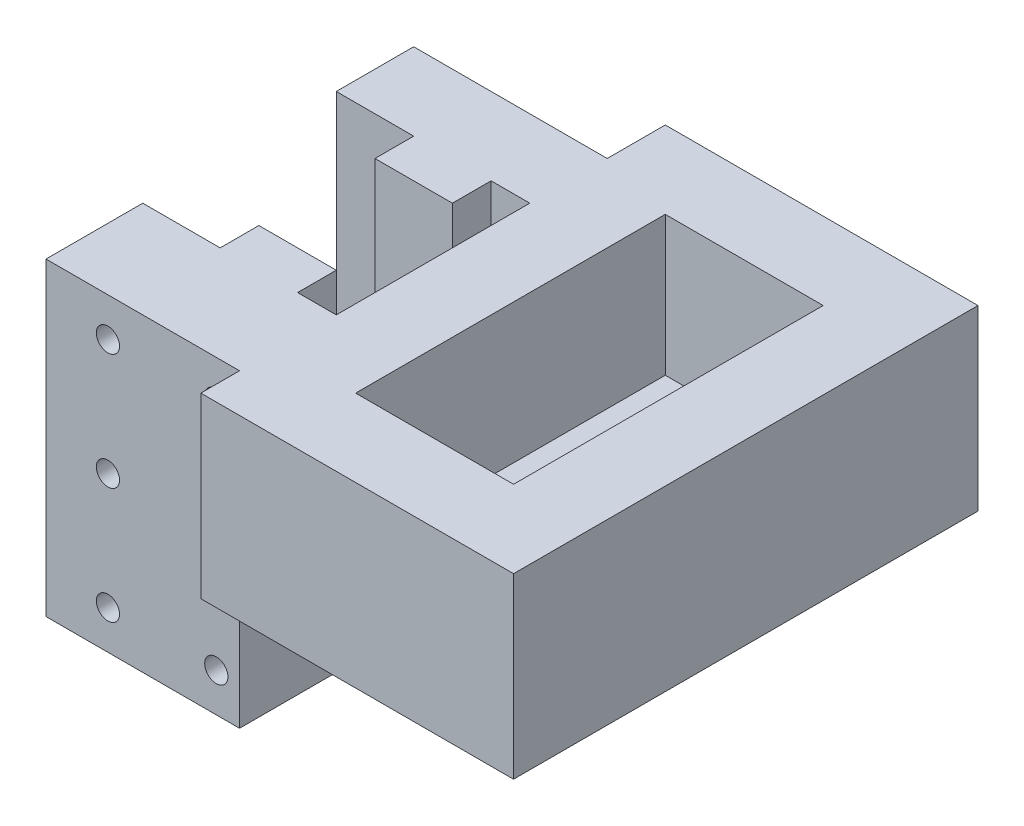
ISO-10303-21;
HEADER;
FILE_DESCRIPTION(('STEP AP214'),'2;1');
FILE_NAME('part.step','',(''),(''),'','','');
FILE_SCHEMA(('AUTOMOTIVE_DESIGN { 1 0 10303 214 1 1 1 1 }'));
ENDSEC;
DATA;
#1=APPLICATION_CONTEXT('core data for automotive mechanical design processes');
#2=APPLICATION_PROTOCOL_DEFINITION('international standard','automotive_design',2000,#1);
#3=PRODUCT_CONTEXT('',#1,'mechanical');
#4=PRODUCT('Part','Part','',(#3));
#5=PRODUCT_RELATED_PRODUCT_CATEGORY('part','',(#4));
#6=PRODUCT_DEFINITION_FORMATION('','',#4);
#7=PRODUCT_DEFINITION_CONTEXT('part definition',#1,'design');
#8=PRODUCT_DEFINITION('design','',#6,#7);
#9=PRODUCT_DEFINITION_SHAPE('','',#8);
#10=(LENGTH_UNIT() NAMED_UNIT(*) SI_UNIT(.MILLI.,.METRE.));
#11=(NAMED_UNIT(*) PLANE_ANGLE_UNIT() SI_UNIT($,.RADIAN.));
#12=(NAMED_UNIT(*) SI_UNIT($,.STERADIAN.) SOLID_ANGLE_UNIT());
#13=UNCERTAINTY_MEASURE_WITH_UNIT(LENGTH_MEASURE(1.E-05),#10,'distance_accuracy_value','');
#14=(GEOMETRIC_REPRESENTATION_CONTEXT(3) GLOBAL_UNCERTAINTY_ASSIGNED_CONTEXT((#13)) GLOBAL_UNIT_ASSIGNED_CONTEXT((#10,
#11,#12)) REPRESENTATION_CONTEXT('',''));
#15=CARTESIAN_POINT('',(0.,0.,0.));
#16=DIRECTION('',(0.,0.,1.));
#17=DIRECTION('',(1.,0.,0.));
#18=AXIS2_PLACEMENT_3D('',#15,#16,#17);
#19=CARTESIAN_POINT('',(-20.2,18.,30.));
#20=DIRECTION('',(1.,0.,0.));
#21=DIRECTION('',(0.,0.,-1.));
#22=AXIS2_PLACEMENT_3D('',#19,#20,#21);
#23=PLANE('',#22);
#24=DIRECTION('',(0.,1.,0.));
#25=VECTOR('',#24,1.);
#26=CARTESIAN_POINT('',(-20.2,-22.,-12.5));
#27=LINE('',#26,#25);
#28=CARTESIAN_POINT('',(-20.2,-5.,-12.5));
#29=VERTEX_POINT('',#28);
#30=CARTESIAN_POINT('',(-20.2,18.,-12.5));
#31=VERTEX_POINT('',#30);
#32=EDGE_CURVE('E303',#29,#31,#27,.T.);
#33=ORIENTED_EDGE('',*,*,#32,.F.);
#34=DIRECTION('',(0.,0.,-1.));
#35=VECTOR('',#34,1.);
#36=CARTESIAN_POINT('',(-20.2,-5.,-30.));
#37=LINE('',#36,#35);
#38=CARTESIAN_POINT('',(-20.2,-5.,12.5));
#39=VERTEX_POINT('',#38);
#40=EDGE_CURVE('E487',#39,#29,#37,.T.);
#41=ORIENTED_EDGE('',*,*,#40,.F.);
#42=DIRECTION('',(0.,1.,0.));
#43=VECTOR('',#42,1.);
#44=CARTESIAN_POINT('',(-20.2,-22.,12.5));
#45=LINE('',#44,#43);
#46=CARTESIAN_POINT('',(-20.2,18.,12.5));
#47=VERTEX_POINT('',#46);
#48=EDGE_CURVE('E328',#39,#47,#45,.T.);
#49=ORIENTED_EDGE('',*,*,#48,.T.);
#50=DIRECTION('',(0.,0.,1.));
#51=VECTOR('',#50,1.);
#52=CARTESIAN_POINT('',(-20.2,18.,30.));
#53=LINE('',#52,#51);
#54=EDGE_CURVE('E410',#31,#47,#53,.T.);
#55=ORIENTED_EDGE('',*,*,#54,.F.);
#56=EDGE_LOOP('',(#33,#41,#49,#55));
#57=FACE_BOUND('',#56,.T.);
#58=ADVANCED_FACE('F38',(#57),#23,.F.);
#59=CARTESIAN_POINT('',(-20.2,18.,25.));
#60=VERTEX_POINT('',#59);
#61=CARTESIAN_POINT('',(-20.2,18.,30.));
#62=VERTEX_POINT('',#61);
#63=EDGE_CURVE('E53',#60,#62,#53,.T.);
#64=ORIENTED_EDGE('',*,*,#63,.F.);
#65=DIRECTION('',(0.,1.,0.));
#66=VECTOR('',#65,1.);
#67=CARTESIAN_POINT('',(-20.2,18.,25.));
#68=LINE('',#67,#66);
#69=CARTESIAN_POINT('',(-20.2,-5.,25.));
#70=VERTEX_POINT('',#69);
#71=EDGE_CURVE('E233',#70,#60,#68,.T.);
#72=ORIENTED_EDGE('',*,*,#71,.F.);
#73=CARTESIAN_POINT('',(-20.2,-5.,30.));
#74=VERTEX_POINT('',#73);
#75=EDGE_CURVE('E359',#74,#70,#37,.T.);
#76=ORIENTED_EDGE('',*,*,#75,.F.);
#77=DIRECTION('',(0.,-1.,0.));
#78=VECTOR('',#77,1.);
#79=CARTESIAN_POINT('',(-20.2,18.,30.));
#80=LINE('',#79,#78);
#81=EDGE_CURVE('E414',#62,#74,#80,.T.);
#82=ORIENTED_EDGE('',*,*,#81,.F.);
#83=EDGE_LOOP('',(#64,#72,#76,#82));
#84=FACE_BOUND('',#83,.T.);
#85=ADVANCED_FACE('F453',(#84),#23,.F.);
#86=CARTESIAN_POINT('',(0.,18.,0.));
#87=DIRECTION('',(0.,1.,0.));
#88=DIRECTION('',(0.,0.,1.));
#89=AXIS2_PLACEMENT_3D('',#86,#87,#88);
#90=PLANE('',#89);
#91=DIRECTION('',(-1.,0.,0.));
#92=VECTOR('',#91,1.);
#93=CARTESIAN_POINT('',(-45.2,18.,25.));
#94=LINE('',#93,#92);
#95=CARTESIAN_POINT('',(-45.2,18.,25.));
#96=VERTEX_POINT('',#95);
#97=EDGE_CURVE('E239',#60,#96,#94,.T.);
#98=ORIENTED_EDGE('',*,*,#97,.F.);
#99=ORIENTED_EDGE('',*,*,#63,.T.);
#100=DIRECTION('',(1.,0.,0.));
#101=VECTOR('',#100,1.);
#102=CARTESIAN_POINT('',(20.2,18.,30.));
#103=LINE('',#102,#101);
#104=CARTESIAN_POINT('',(20.2,18.,30.));
#105=VERTEX_POINT('',#104);
#106=EDGE_CURVE('E409',#62,#105,#103,.T.);
#107=ORIENTED_EDGE('',*,*,#106,.T.);
#108=DIRECTION('',(0.,0.,-1.));
#109=VECTOR('',#108,1.);
#110=CARTESIAN_POINT('',(20.2,18.,30.));
#111=LINE('',#110,#109);
#112=CARTESIAN_POINT('',(20.2,18.,-30.));
#113=VERTEX_POINT('',#112);
#114=EDGE_CURVE('E401',#105,#113,#111,.T.);
#115=ORIENTED_EDGE('',*,*,#114,.T.);
#116=DIRECTION('',(-1.,0.,0.));
#117=VECTOR('',#116,1.);
#118=CARTESIAN_POINT('',(20.2,18.,-30.));
#119=LINE('',#118,#117);
#120=CARTESIAN_POINT('',(-20.2,18.,-30.));
#121=VERTEX_POINT('',#120);
#122=EDGE_CURVE('E404',#113,#121,#119,.T.);
#123=ORIENTED_EDGE('',*,*,#122,.T.);
#124=CARTESIAN_POINT('',(-20.2,18.,-22.5));
#125=VERTEX_POINT('',#124);
#126=EDGE_CURVE('E406',#121,#125,#53,.T.);
#127=ORIENTED_EDGE('',*,*,#126,.T.);
#128=DIRECTION('',(-1.,0.,0.));
#129=VECTOR('',#128,1.);
#130=CARTESIAN_POINT('',(-20.2,18.,-22.5));
#131=LINE('',#130,#129);
#132=CARTESIAN_POINT('',(-45.2,18.,-22.5));
#133=VERTEX_POINT('',#132);
#134=EDGE_CURVE('E277',#125,#133,#131,.T.);
#135=ORIENTED_EDGE('',*,*,#134,.T.);
#136=DIRECTION('',(0.,0.,1.));
#137=VECTOR('',#136,1.);
#138=CARTESIAN_POINT('',(-45.2,18.,-22.5));
#139=LINE('',#138,#137);
#140=CARTESIAN_POINT('',(-45.2,18.,-12.5));
#141=VERTEX_POINT('',#140);
#142=EDGE_CURVE('E280',#133,#141,#139,.T.);
#143=ORIENTED_EDGE('',*,*,#142,.T.);
#144=DIRECTION('',(1.,0.,0.));
#145=VECTOR('',#144,1.);
#146=CARTESIAN_POINT('',(-45.2,18.,-12.5));
#147=LINE('',#146,#145);
#148=CARTESIAN_POINT('',(-35.2,18.,-12.5));
#149=VERTEX_POINT('',#148);
#150=EDGE_CURVE('E284',#141,#149,#147,.T.);
#151=ORIENTED_EDGE('',*,*,#150,.T.);
#152=DIRECTION('',(0.,0.,1.));
#153=VECTOR('',#152,1.);
#154=CARTESIAN_POINT('',(-35.2,18.,-12.5));
#155=LINE('',#154,#153);
#156=CARTESIAN_POINT('',(-35.2,18.,-7.5));
#157=VERTEX_POINT('',#156);
#158=EDGE_CURVE('E287',#149,#157,#155,.T.);
#159=ORIENTED_EDGE('',*,*,#158,.T.);
#160=DIRECTION('',(1.,0.,0.));
#161=VECTOR('',#160,1.);
#162=CARTESIAN_POINT('',(-35.2,18.,-7.5));
#163=LINE('',#162,#161);
#164=CARTESIAN_POINT('',(-25.2,18.,-7.5));
#165=VERTEX_POINT('',#164);
#166=EDGE_CURVE('E290',#157,#165,#163,.T.);
#167=ORIENTED_EDGE('',*,*,#166,.T.);
#168=DIRECTION('',(0.,0.,-1.));
#169=VECTOR('',#168,1.);
#170=CARTESIAN_POINT('',(-25.2,18.,-7.5));
#171=LINE('',#170,#169);
#172=CARTESIAN_POINT('',(-25.2,18.,-12.5));
#173=VERTEX_POINT('',#172);
#174=EDGE_CURVE('E293',#165,#173,#171,.T.);
#175=ORIENTED_EDGE('',*,*,#174,.T.);
#176=DIRECTION('',(1.,0.,0.));
#177=VECTOR('',#176,1.);
#178=CARTESIAN_POINT('',(-25.2,18.,-12.5));
#179=LINE('',#178,#177);
#180=EDGE_CURVE('E255',#173,#31,#179,.T.);
#181=ORIENTED_EDGE('',*,*,#180,.T.);
#182=ORIENTED_EDGE('',*,*,#54,.T.);
#183=DIRECTION('',(-1.,0.,0.));
#184=VECTOR('',#183,1.);
#185=CARTESIAN_POINT('',(-25.2,18.,12.5));
#186=LINE('',#185,#184);
#187=CARTESIAN_POINT('',(-25.2,18.,12.5));
#188=VERTEX_POINT('',#187);
#189=EDGE_CURVE('E281',#47,#188,#186,.T.);
#190=ORIENTED_EDGE('',*,*,#189,.T.);
#191=DIRECTION('',(0.,0.,-1.));
#192=VECTOR('',#191,1.);
#193=CARTESIAN_POINT('',(-25.2,18.,7.5));
#194=LINE('',#193,#192);
#195=CARTESIAN_POINT('',(-25.2,18.,7.5));
#196=VERTEX_POINT('',#195);
#197=EDGE_CURVE('E341',#188,#196,#194,.T.);
#198=ORIENTED_EDGE('',*,*,#197,.T.);
#199=DIRECTION('',(-1.,0.,0.));
#200=VECTOR('',#199,1.);
#201=CARTESIAN_POINT('',(-35.2,18.,7.5));
#202=LINE('',#201,#200);
#203=CARTESIAN_POINT('',(-35.2,18.,7.5));
#204=VERTEX_POINT('',#203);
#205=EDGE_CURVE('E338',#196,#204,#202,.T.);
#206=ORIENTED_EDGE('',*,*,#205,.T.);
#207=DIRECTION('',(0.,0.,1.));
#208=VECTOR('',#207,1.);
#209=CARTESIAN_POINT('',(-35.2,18.,12.5));
#210=LINE('',#209,#208);
#211=CARTESIAN_POINT('',(-35.2,18.,12.5));
#212=VERTEX_POINT('',#211);
#213=EDGE_CURVE('E335',#204,#212,#210,.T.);
#214=ORIENTED_EDGE('',*,*,#213,.T.);
#215=DIRECTION('',(-1.,0.,0.));
#216=VECTOR('',#215,1.);
#217=CARTESIAN_POINT('',(-45.2,18.,12.5));
#218=LINE('',#217,#216);
#219=CARTESIAN_POINT('',(-45.2,18.,12.5));
#220=VERTEX_POINT('',#219);
#221=EDGE_CURVE('E331',#212,#220,#218,.T.);
#222=ORIENTED_EDGE('',*,*,#221,.T.);
#223=DIRECTION('',(0.,0.,1.));
#224=VECTOR('',#223,1.);
#225=CARTESIAN_POINT('',(-45.2,18.,22.5));
#226=LINE('',#225,#224);
#227=EDGE_CURVE('E329',#220,#96,#226,.T.);
#228=ORIENTED_EDGE('',*,*,#227,.T.);
#229=EDGE_LOOP('',(#98,#99,#107,#115,#123,#127,#135,#143,#151,#159,#167,#175,#181,#182,#190,
#198,#206,#214,#222,#228));
#230=FACE_BOUND('',#229,.T.);
#231=DIRECTION('',(1.,0.,0.));
#232=VECTOR('',#231,1.);
#233=CARTESIAN_POINT('',(10.2,18.,20.));
#234=LINE('',#233,#232);
#235=CARTESIAN_POINT('',(-10.2,18.,20.));
#236=VERTEX_POINT('',#235);
#237=CARTESIAN_POINT('',(10.2,18.,20.));
#238=VERTEX_POINT('',#237);
#239=EDGE_CURVE('E374',#236,#238,#234,.T.);
#240=ORIENTED_EDGE('',*,*,#239,.F.);
#241=DIRECTION('',(0.,0.,1.));
#242=VECTOR('',#241,1.);
#243=CARTESIAN_POINT('',(-10.2,18.,20.));
#244=LINE('',#243,#242);
#245=CARTESIAN_POINT('',(-10.2,18.,-20.));
#246=VERTEX_POINT('',#245);
#247=EDGE_CURVE('E372',#246,#236,#244,.T.);
#248=ORIENTED_EDGE('',*,*,#247,.F.);
#249=DIRECTION('',(-1.,0.,0.));
#250=VECTOR('',#249,1.);
#251=CARTESIAN_POINT('',(10.2,18.,-20.));
#252=LINE('',#251,#250);
#253=CARTESIAN_POINT('',(10.2,18.,-20.));
#254=VERTEX_POINT('',#253);
#255=EDGE_CURVE('E380',#254,#246,#252,.T.);
#256=ORIENTED_EDGE('',*,*,#255,.F.);
#257=DIRECTION('',(0.,0.,-1.));
#258=VECTOR('',#257,1.);
#259=CARTESIAN_POINT('',(10.2,18.,20.));
#260=LINE('',#259,#258);
#261=EDGE_CURVE('E377',#238,#254,#260,.T.);
#262=ORIENTED_EDGE('',*,*,#261,.F.);
#263=EDGE_LOOP('',(#240,#248,#256,#262));
#264=FACE_BOUND('',#263,.T.);
#265=ADVANCED_FACE('F462',(#230,#264),#90,.T.);
#266=CARTESIAN_POINT('',(20.2,18.,30.));
#267=DIRECTION('',(-1.,0.,0.));
#268=DIRECTION('',(0.,0.,1.));
#269=AXIS2_PLACEMENT_3D('',#266,#267,#268);
#270=PLANE('',#269);
#271=DIRECTION('',(0.,-1.,0.));
#272=VECTOR('',#271,1.);
#273=CARTESIAN_POINT('',(20.2,18.,30.));
#274=LINE('',#273,#272);
#275=CARTESIAN_POINT('',(20.2,-5.,30.));
#276=VERTEX_POINT('',#275);
#277=EDGE_CURVE('E412',#105,#276,#274,.T.);
#278=ORIENTED_EDGE('',*,*,#277,.T.);
#279=DIRECTION('',(0.,0.,1.));
#280=VECTOR('',#279,1.);
#281=CARTESIAN_POINT('',(20.2,-5.,-30.));
#282=LINE('',#281,#280);
#283=CARTESIAN_POINT('',(20.2,-5.,-30.));
#284=VERTEX_POINT('',#283);
#285=EDGE_CURVE('E365',#284,#276,#282,.T.);
#286=ORIENTED_EDGE('',*,*,#285,.F.);
#287=DIRECTION('',(0.,-1.,0.));
#288=VECTOR('',#287,1.);
#289=CARTESIAN_POINT('',(20.2,18.,-30.));
#290=LINE('',#289,#288);
#291=EDGE_CURVE('E419',#113,#284,#290,.T.);
#292=ORIENTED_EDGE('',*,*,#291,.F.);
#293=ORIENTED_EDGE('',*,*,#114,.F.);
#294=EDGE_LOOP('',(#278,#286,#292,#293));
#295=FACE_BOUND('',#294,.T.);
#296=ADVANCED_FACE('F40',(#295),#270,.F.);
#297=CARTESIAN_POINT('',(20.2,18.,-30.));
#298=DIRECTION('',(0.,0.,1.));
#299=DIRECTION('',(1.,0.,0.));
#300=AXIS2_PLACEMENT_3D('',#297,#298,#299);
#301=PLANE('',#300);
#302=ORIENTED_EDGE('',*,*,#291,.T.);
#303=DIRECTION('',(1.,0.,0.));
#304=VECTOR('',#303,1.);
#305=CARTESIAN_POINT('',(20.2,-5.,-30.));
#306=LINE('',#305,#304);
#307=CARTESIAN_POINT('',(-20.2,-5.,-30.));
#308=VERTEX_POINT('',#307);
#309=EDGE_CURVE('E362',#308,#284,#306,.T.);
#310=ORIENTED_EDGE('',*,*,#309,.F.);
#311=DIRECTION('',(0.,-1.,0.));
#312=VECTOR('',#311,1.);
#313=CARTESIAN_POINT('',(-20.2,18.,-30.));
#314=LINE('',#313,#312);
#315=EDGE_CURVE('E416',#121,#308,#314,.T.);
#316=ORIENTED_EDGE('',*,*,#315,.F.);
#317=ORIENTED_EDGE('',*,*,#122,.F.);
#318=EDGE_LOOP('',(#302,#310,#316,#317));
#319=FACE_BOUND('',#318,.T.);
#320=ADVANCED_FACE('F466',(#319),#301,.F.);
#321=CARTESIAN_POINT('',(-20.2,-5.,-22.5));
#322=VERTEX_POINT('',#321);
#323=EDGE_CURVE('E301',#322,#308,#37,.T.);
#324=ORIENTED_EDGE('',*,*,#323,.F.);
#325=DIRECTION('',(0.,1.,0.));
#326=VECTOR('',#325,1.);
#327=CARTESIAN_POINT('',(-20.2,-22.,-22.5));
#328=LINE('',#327,#326);
#329=EDGE_CURVE('E317',#322,#125,#328,.T.);
#330=ORIENTED_EDGE('',*,*,#329,.T.);
#331=ORIENTED_EDGE('',*,*,#126,.F.);
#332=ORIENTED_EDGE('',*,*,#315,.T.);
#333=EDGE_LOOP('',(#324,#330,#331,#332));
#334=FACE_BOUND('',#333,.T.);
#335=ADVANCED_FACE('F456',(#334),#23,.F.);
#336=CARTESIAN_POINT('',(20.2,18.,30.));
#337=DIRECTION('',(0.,0.,-1.));
#338=DIRECTION('',(-1.,0.,0.));
#339=AXIS2_PLACEMENT_3D('',#336,#337,#338);
#340=PLANE('',#339);
#341=ORIENTED_EDGE('',*,*,#81,.T.);
#342=DIRECTION('',(-1.,0.,0.));
#343=VECTOR('',#342,1.);
#344=CARTESIAN_POINT('',(20.2,-5.,30.));
#345=LINE('',#344,#343);
#346=EDGE_CURVE('E368',#276,#74,#345,.T.);
#347=ORIENTED_EDGE('',*,*,#346,.F.);
#348=ORIENTED_EDGE('',*,*,#277,.F.);
#349=ORIENTED_EDGE('',*,*,#106,.F.);
#350=EDGE_LOOP('',(#341,#347,#348,#349));
#351=FACE_BOUND('',#350,.T.);
#352=ADVANCED_FACE('F465',(#351),#340,.F.);
#353=CARTESIAN_POINT('',(-10.2,18.,20.));
#354=DIRECTION('',(1.,0.,0.));
#355=DIRECTION('',(0.,0.,-1.));
#356=AXIS2_PLACEMENT_3D('',#353,#354,#355);
#357=PLANE('',#356);
#358=DIRECTION('',(0.,0.,1.));
#359=VECTOR('',#358,1.);
#360=CARTESIAN_POINT('',(-10.2,0.,20.));
#361=LINE('',#360,#359);
#362=CARTESIAN_POINT('',(-10.2,0.,-20.));
#363=VERTEX_POINT('',#362);
#364=CARTESIAN_POINT('',(-10.2,0.,20.));
#365=VERTEX_POINT('',#364);
#366=EDGE_CURVE('E371',#363,#365,#361,.T.);
#367=ORIENTED_EDGE('',*,*,#366,.F.);
#368=DIRECTION('',(0.,-1.,0.));
#369=VECTOR('',#368,1.);
#370=CARTESIAN_POINT('',(-10.2,18.,-20.));
#371=LINE('',#370,#369);
#372=EDGE_CURVE('E382',#246,#363,#371,.T.);
#373=ORIENTED_EDGE('',*,*,#372,.F.);
#374=ORIENTED_EDGE('',*,*,#247,.T.);
#375=DIRECTION('',(0.,-1.,0.));
#376=VECTOR('',#375,1.);
#377=CARTESIAN_POINT('',(-10.2,18.,20.));
#378=LINE('',#377,#376);
#379=EDGE_CURVE('E398',#236,#365,#378,.T.);
#380=ORIENTED_EDGE('',*,*,#379,.T.);
#381=EDGE_LOOP('',(#367,#373,#374,#380));
#382=FACE_BOUND('',#381,.T.);
#383=ADVANCED_FACE('F472',(#382),#357,.T.);
#384=CARTESIAN_POINT('',(10.2,18.,20.));
#385=DIRECTION('',(0.,0.,-1.));
#386=DIRECTION('',(-1.,0.,0.));
#387=AXIS2_PLACEMENT_3D('',#384,#385,#386);
#388=PLANE('',#387);
#389=DIRECTION('',(1.,0.,0.));
#390=VECTOR('',#389,1.);
#391=CARTESIAN_POINT('',(10.2,0.,20.));
#392=LINE('',#391,#390);
#393=CARTESIAN_POINT('',(10.2,0.,20.));
#394=VERTEX_POINT('',#393);
#395=EDGE_CURVE('E385',#365,#394,#392,.T.);
#396=ORIENTED_EDGE('',*,*,#395,.F.);
#397=ORIENTED_EDGE('',*,*,#379,.F.);
#398=ORIENTED_EDGE('',*,*,#239,.T.);
#399=DIRECTION('',(0.,-1.,0.));
#400=VECTOR('',#399,1.);
#401=CARTESIAN_POINT('',(10.2,18.,20.));
#402=LINE('',#401,#400);
#403=EDGE_CURVE('E396',#238,#394,#402,.T.);
#404=ORIENTED_EDGE('',*,*,#403,.T.);
#405=EDGE_LOOP('',(#396,#397,#398,#404));
#406=FACE_BOUND('',#405,.T.);
#407=ADVANCED_FACE('F856',(#406),#388,.T.);
#408=CARTESIAN_POINT('',(10.2,18.,20.));
#409=DIRECTION('',(-1.,0.,0.));
#410=DIRECTION('',(0.,0.,1.));
#411=AXIS2_PLACEMENT_3D('',#408,#409,#410);
#412=PLANE('',#411);
#413=DIRECTION('',(0.,0.,-1.));
#414=VECTOR('',#413,1.);
#415=CARTESIAN_POINT('',(10.2,0.,20.));
#416=LINE('',#415,#414);
#417=CARTESIAN_POINT('',(10.2,0.,-20.));
#418=VERTEX_POINT('',#417);
#419=EDGE_CURVE('E388',#394,#418,#416,.T.);
#420=ORIENTED_EDGE('',*,*,#419,.F.);
#421=ORIENTED_EDGE('',*,*,#403,.F.);
#422=ORIENTED_EDGE('',*,*,#261,.T.);
#423=DIRECTION('',(0.,-1.,0.));
#424=VECTOR('',#423,1.);
#425=CARTESIAN_POINT('',(10.2,18.,-20.));
#426=LINE('',#425,#424);
#427=EDGE_CURVE('E394',#254,#418,#426,.T.);
#428=ORIENTED_EDGE('',*,*,#427,.T.);
#429=EDGE_LOOP('',(#420,#421,#422,#428));
#430=FACE_BOUND('',#429,.T.);
#431=ADVANCED_FACE('F846',(#430),#412,.T.);
#432=CARTESIAN_POINT('',(10.2,18.,-20.));
#433=DIRECTION('',(0.,0.,1.));
#434=DIRECTION('',(1.,0.,0.));
#435=AXIS2_PLACEMENT_3D('',#432,#433,#434);
#436=PLANE('',#435);
#437=DIRECTION('',(-1.,0.,0.));
#438=VECTOR('',#437,1.);
#439=CARTESIAN_POINT('',(10.2,0.,-20.));
#440=LINE('',#439,#438);
#441=EDGE_CURVE('E375',#418,#363,#440,.T.);
#442=ORIENTED_EDGE('',*,*,#441,.F.);
#443=ORIENTED_EDGE('',*,*,#427,.F.);
#444=ORIENTED_EDGE('',*,*,#255,.T.);
#445=ORIENTED_EDGE('',*,*,#372,.T.);
#446=EDGE_LOOP('',(#442,#443,#444,#445));
#447=FACE_BOUND('',#446,.T.);
#448=ADVANCED_FACE('F836',(#447),#436,.T.);
#449=CARTESIAN_POINT('',(0.,0.,0.));
#450=DIRECTION('',(0.,-1.,0.));
#451=DIRECTION('',(0.,0.,-1.));
#452=AXIS2_PLACEMENT_3D('',#449,#450,#451);
#453=PLANE('',#452);
#454=ORIENTED_EDGE('',*,*,#441,.T.);
#455=ORIENTED_EDGE('',*,*,#366,.T.);
#456=ORIENTED_EDGE('',*,*,#395,.T.);
#457=ORIENTED_EDGE('',*,*,#419,.T.);
#458=EDGE_LOOP('',(#454,#455,#456,#457));
#459=FACE_BOUND('',#458,.T.);
#460=ADVANCED_FACE('F664',(#459),#453,.F.);
#461=CARTESIAN_POINT('',(0.,-5.,0.));
#462=DIRECTION('',(0.,-1.,0.));
#463=DIRECTION('',(0.,0.,-1.));
#464=AXIS2_PLACEMENT_3D('',#461,#462,#463);
#465=PLANE('',#464);
#466=ORIENTED_EDGE('',*,*,#75,.T.);
#467=EDGE_CURVE('E61',#70,#39,#37,.T.);
#468=ORIENTED_EDGE('',*,*,#467,.T.);
#469=ORIENTED_EDGE('',*,*,#40,.T.);
#470=EDGE_CURVE('E483',#29,#322,#37,.T.);
#471=ORIENTED_EDGE('',*,*,#470,.T.);
#472=ORIENTED_EDGE('',*,*,#323,.T.);
#473=ORIENTED_EDGE('',*,*,#309,.T.);
#474=ORIENTED_EDGE('',*,*,#285,.T.);
#475=ORIENTED_EDGE('',*,*,#346,.T.);
#476=EDGE_LOOP('',(#466,#468,#469,#471,#472,#473,#474,#475));
#477=FACE_BOUND('',#476,.T.);
#478=ADVANCED_FACE('F485',(#477),#465,.T.);
#479=CARTESIAN_POINT('',(-20.2,-22.,12.5));
#480=DIRECTION('',(1.,0.,0.));
#481=DIRECTION('',(0.,0.,-1.));
#482=AXIS2_PLACEMENT_3D('',#479,#480,#481);
#483=PLANE('',#482);
#484=ORIENTED_EDGE('',*,*,#467,.F.);
#485=CARTESIAN_POINT('',(-20.2,-22.,25.));
#486=VERTEX_POINT('',#485);
#487=EDGE_CURVE('E247',#486,#70,#68,.T.);
#488=ORIENTED_EDGE('',*,*,#487,.F.);
#489=DIRECTION('',(0.,0.,-1.));
#490=VECTOR('',#489,1.);
#491=CARTESIAN_POINT('',(-20.2,-22.,12.5));
#492=LINE('',#491,#490);
#493=CARTESIAN_POINT('',(-20.2,-22.,12.5));
#494=VERTEX_POINT('',#493);
#495=EDGE_CURVE('E224',#486,#494,#492,.T.);
#496=ORIENTED_EDGE('',*,*,#495,.T.);
#497=EDGE_CURVE('E250',#494,#39,#45,.T.);
#498=ORIENTED_EDGE('',*,*,#497,.T.);
#499=EDGE_LOOP('',(#484,#488,#496,#498));
#500=FACE_BOUND('',#499,.T.);
#501=ADVANCED_FACE('F491',(#500),#483,.T.);
#502=CARTESIAN_POINT('',(-25.2,-22.,12.5));
#503=DIRECTION('',(0.,0.,-1.));
#504=DIRECTION('',(-1.,0.,0.));
#505=AXIS2_PLACEMENT_3D('',#502,#503,#504);
#506=PLANE('',#505);
#507=ORIENTED_EDGE('',*,*,#189,.F.);
#508=ORIENTED_EDGE('',*,*,#48,.F.);
#509=ORIENTED_EDGE('',*,*,#497,.F.);
#510=DIRECTION('',(-1.,0.,0.));
#511=VECTOR('',#510,1.);
#512=CARTESIAN_POINT('',(-25.2,-22.,12.5));
#513=LINE('',#512,#511);
#514=CARTESIAN_POINT('',(-25.2,-22.,12.5));
#515=VERTEX_POINT('',#514);
#516=EDGE_CURVE('E332',#494,#515,#513,.T.);
#517=ORIENTED_EDGE('',*,*,#516,.T.);
#518=DIRECTION('',(0.,1.,0.));
#519=VECTOR('',#518,1.);
#520=CARTESIAN_POINT('',(-25.2,-22.,12.5));
#521=LINE('',#520,#519);
#522=EDGE_CURVE('E318',#515,#188,#521,.T.);
#523=ORIENTED_EDGE('',*,*,#522,.T.);
#524=EDGE_LOOP('',(#507,#508,#509,#517,#523));
#525=FACE_BOUND('',#524,.T.);
#526=ADVANCED_FACE('F538',(#525),#506,.T.);
#527=CARTESIAN_POINT('',(-45.2,-22.,22.5));
#528=DIRECTION('',(-1.,0.,0.));
#529=DIRECTION('',(0.,0.,1.));
#530=AXIS2_PLACEMENT_3D('',#527,#528,#529);
#531=PLANE('',#530);
#532=ORIENTED_EDGE('',*,*,#227,.F.);
#533=DIRECTION('',(0.,1.,0.));
#534=VECTOR('',#533,1.);
#535=CARTESIAN_POINT('',(-45.2,-22.,12.5));
#536=LINE('',#535,#534);
#537=CARTESIAN_POINT('',(-45.2,-22.,12.5));
#538=VERTEX_POINT('',#537);
#539=EDGE_CURVE('E219',#538,#220,#536,.T.);
#540=ORIENTED_EDGE('',*,*,#539,.F.);
#541=DIRECTION('',(0.,0.,1.));
#542=VECTOR('',#541,1.);
#543=CARTESIAN_POINT('',(-45.2,-22.,22.5));
#544=LINE('',#543,#542);
#545=CARTESIAN_POINT('',(-45.2,-22.,25.));
#546=VERTEX_POINT('',#545);
#547=EDGE_CURVE('E213',#538,#546,#544,.T.);
#548=ORIENTED_EDGE('',*,*,#547,.T.);
#549=DIRECTION('',(0.,-1.,0.));
#550=VECTOR('',#549,1.);
#551=CARTESIAN_POINT('',(-45.2,18.,25.));
#552=LINE('',#551,#550);
#553=EDGE_CURVE('E218',#96,#546,#552,.T.);
#554=ORIENTED_EDGE('',*,*,#553,.F.);
#555=EDGE_LOOP('',(#532,#540,#548,#554));
#556=FACE_BOUND('',#555,.T.);
#557=ADVANCED_FACE('F216',(#556),#531,.T.);
#558=CARTESIAN_POINT('',(-45.2,-22.,12.5));
#559=DIRECTION('',(0.,0.,-1.));
#560=DIRECTION('',(-1.,0.,0.));
#561=AXIS2_PLACEMENT_3D('',#558,#559,#560);
#562=PLANE('',#561);
#563=ORIENTED_EDGE('',*,*,#221,.F.);
#564=DIRECTION('',(0.,1.,0.));
#565=VECTOR('',#564,1.);
#566=CARTESIAN_POINT('',(-35.2,-22.,12.5));
#567=LINE('',#566,#565);
#568=CARTESIAN_POINT('',(-35.2,-22.,12.5));
#569=VERTEX_POINT('',#568);
#570=EDGE_CURVE('E324',#569,#212,#567,.T.);
#571=ORIENTED_EDGE('',*,*,#570,.F.);
#572=DIRECTION('',(-1.,0.,0.));
#573=VECTOR('',#572,1.);
#574=CARTESIAN_POINT('',(-45.2,-22.,12.5));
#575=LINE('',#574,#573);
#576=EDGE_CURVE('E223',#569,#538,#575,.T.);
#577=ORIENTED_EDGE('',*,*,#576,.T.);
#578=ORIENTED_EDGE('',*,*,#539,.T.);
#579=EDGE_LOOP('',(#563,#571,#577,#578));
#580=FACE_BOUND('',#579,.T.);
#581=ADVANCED_FACE('F526',(#580),#562,.T.);
#582=CARTESIAN_POINT('',(-35.2,-22.,12.5));
#583=DIRECTION('',(-1.,0.,0.));
#584=DIRECTION('',(0.,0.,1.));
#585=AXIS2_PLACEMENT_3D('',#582,#583,#584);
#586=PLANE('',#585);
#587=ORIENTED_EDGE('',*,*,#213,.F.);
#588=DIRECTION('',(0.,1.,0.));
#589=VECTOR('',#588,1.);
#590=CARTESIAN_POINT('',(-35.2,-22.,7.5));
#591=LINE('',#590,#589);
#592=CARTESIAN_POINT('',(-35.2,-22.,7.5));
#593=VERTEX_POINT('',#592);
#594=EDGE_CURVE('E322',#593,#204,#591,.T.);
#595=ORIENTED_EDGE('',*,*,#594,.F.);
#596=DIRECTION('',(0.,0.,1.));
#597=VECTOR('',#596,1.);
#598=CARTESIAN_POINT('',(-35.2,-22.,12.5));
#599=LINE('',#598,#597);
#600=EDGE_CURVE('E348',#593,#569,#599,.T.);
#601=ORIENTED_EDGE('',*,*,#600,.T.);
#602=ORIENTED_EDGE('',*,*,#570,.T.);
#603=EDGE_LOOP('',(#587,#595,#601,#602));
#604=FACE_BOUND('',#603,.T.);
#605=ADVANCED_FACE('F530',(#604),#586,.T.);
#606=CARTESIAN_POINT('',(-35.2,-22.,7.5));
#607=DIRECTION('',(0.,0.,-1.));
#608=DIRECTION('',(-1.,0.,0.));
#609=AXIS2_PLACEMENT_3D('',#606,#607,#608);
#610=PLANE('',#609);
#611=ORIENTED_EDGE('',*,*,#205,.F.);
#612=DIRECTION('',(0.,1.,0.));
#613=VECTOR('',#612,1.);
#614=CARTESIAN_POINT('',(-25.2,-22.,7.5));
#615=LINE('',#614,#613);
#616=CARTESIAN_POINT('',(-25.2,-22.,7.5));
#617=VERTEX_POINT('',#616);
#618=EDGE_CURVE('E320',#617,#196,#615,.T.);
#619=ORIENTED_EDGE('',*,*,#618,.F.);
#620=DIRECTION('',(-1.,0.,0.));
#621=VECTOR('',#620,1.);
#622=CARTESIAN_POINT('',(-35.2,-22.,7.5));
#623=LINE('',#622,#621);
#624=EDGE_CURVE('E351',#617,#593,#623,.T.);
#625=ORIENTED_EDGE('',*,*,#624,.T.);
#626=ORIENTED_EDGE('',*,*,#594,.T.);
#627=EDGE_LOOP('',(#611,#619,#625,#626));
#628=FACE_BOUND('',#627,.T.);
#629=ADVANCED_FACE('F533',(#628),#610,.T.);
#630=CARTESIAN_POINT('',(-25.2,-22.,7.5));
#631=DIRECTION('',(1.,0.,0.));
#632=DIRECTION('',(0.,0.,-1.));
#633=AXIS2_PLACEMENT_3D('',#630,#631,#632);
#634=PLANE('',#633);
#635=ORIENTED_EDGE('',*,*,#197,.F.);
#636=ORIENTED_EDGE('',*,*,#522,.F.);
#637=DIRECTION('',(0.,0.,-1.));
#638=VECTOR('',#637,1.);
#639=CARTESIAN_POINT('',(-25.2,-22.,7.5));
#640=LINE('',#639,#638);
#641=EDGE_CURVE('E354',#515,#617,#640,.T.);
#642=ORIENTED_EDGE('',*,*,#641,.T.);
#643=ORIENTED_EDGE('',*,*,#618,.T.);
#644=EDGE_LOOP('',(#635,#636,#642,#643));
#645=FACE_BOUND('',#644,.T.);
#646=ADVANCED_FACE('F537',(#645),#634,.T.);
#647=CARTESIAN_POINT('',(0.,-22.,0.));
#648=DIRECTION('',(0.,-1.,0.));
#649=DIRECTION('',(0.,0.,-1.));
#650=AXIS2_PLACEMENT_3D('',#647,#648,#649);
#651=PLANE('',#650);
#652=ORIENTED_EDGE('',*,*,#516,.F.);
#653=ORIENTED_EDGE('',*,*,#495,.F.);
#654=DIRECTION('',(1.,0.,0.));
#655=VECTOR('',#654,1.);
#656=CARTESIAN_POINT('',(-45.2,-22.,25.));
#657=LINE('',#656,#655);
#658=EDGE_CURVE('E227',#546,#486,#657,.T.);
#659=ORIENTED_EDGE('',*,*,#658,.F.);
#660=ORIENTED_EDGE('',*,*,#547,.F.);
#661=ORIENTED_EDGE('',*,*,#576,.F.);
#662=ORIENTED_EDGE('',*,*,#600,.F.);
#663=ORIENTED_EDGE('',*,*,#624,.F.);
#664=ORIENTED_EDGE('',*,*,#641,.F.);
#665=EDGE_LOOP('',(#652,#653,#659,#660,#661,#662,#663,#664));
#666=FACE_BOUND('',#665,.T.);
#667=ADVANCED_FACE('F229',(#666),#651,.T.);
#668=CARTESIAN_POINT('',(-20.2,-22.,-12.5));
#669=DIRECTION('',(1.,0.,0.));
#670=DIRECTION('',(0.,0.,-1.));
#671=AXIS2_PLACEMENT_3D('',#668,#669,#670);
#672=PLANE('',#671);
#673=ORIENTED_EDGE('',*,*,#470,.F.);
#674=CARTESIAN_POINT('',(-20.2,-22.,-12.5));
#675=VERTEX_POINT('',#674);
#676=EDGE_CURVE('E298',#675,#29,#27,.T.);
#677=ORIENTED_EDGE('',*,*,#676,.F.);
#678=DIRECTION('',(0.,0.,-1.));
#679=VECTOR('',#678,1.);
#680=CARTESIAN_POINT('',(-20.2,-22.,-12.5));
#681=LINE('',#680,#679);
#682=CARTESIAN_POINT('',(-20.2,-22.,-22.5));
#683=VERTEX_POINT('',#682);
#684=EDGE_CURVE('E251',#675,#683,#681,.T.);
#685=ORIENTED_EDGE('',*,*,#684,.T.);
#686=EDGE_CURVE('E276',#683,#322,#328,.T.);
#687=ORIENTED_EDGE('',*,*,#686,.T.);
#688=EDGE_LOOP('',(#673,#677,#685,#687));
#689=FACE_BOUND('',#688,.T.);
#690=ADVANCED_FACE('F513',(#689),#672,.T.);
#691=CARTESIAN_POINT('',(-25.2,-22.,-12.5));
#692=DIRECTION('',(0.,0.,1.));
#693=DIRECTION('',(1.,0.,0.));
#694=AXIS2_PLACEMENT_3D('',#691,#692,#693);
#695=PLANE('',#694);
#696=ORIENTED_EDGE('',*,*,#180,.F.);
#697=DIRECTION('',(0.,1.,0.));
#698=VECTOR('',#697,1.);
#699=CARTESIAN_POINT('',(-25.2,-22.,-12.5));
#700=LINE('',#699,#698);
#701=CARTESIAN_POINT('',(-25.2,-22.,-12.5));
#702=VERTEX_POINT('',#701);
#703=EDGE_CURVE('E302',#702,#173,#700,.T.);
#704=ORIENTED_EDGE('',*,*,#703,.F.);
#705=DIRECTION('',(1.,0.,0.));
#706=VECTOR('',#705,1.);
#707=CARTESIAN_POINT('',(-25.2,-22.,-12.5));
#708=LINE('',#707,#706);
#709=EDGE_CURVE('E273',#702,#675,#708,.T.);
#710=ORIENTED_EDGE('',*,*,#709,.T.);
#711=ORIENTED_EDGE('',*,*,#676,.T.);
#712=ORIENTED_EDGE('',*,*,#32,.T.);
#713=EDGE_LOOP('',(#696,#704,#710,#711,#712));
#714=FACE_BOUND('',#713,.T.);
#715=ADVANCED_FACE('F498',(#714),#695,.T.);
#716=CARTESIAN_POINT('',(-25.2,-22.,-7.5));
#717=DIRECTION('',(1.,0.,0.));
#718=DIRECTION('',(0.,0.,-1.));
#719=AXIS2_PLACEMENT_3D('',#716,#717,#718);
#720=PLANE('',#719);
#721=ORIENTED_EDGE('',*,*,#174,.F.);
#722=DIRECTION('',(0.,1.,0.));
#723=VECTOR('',#722,1.);
#724=CARTESIAN_POINT('',(-25.2,-22.,-7.5));
#725=LINE('',#724,#723);
#726=CARTESIAN_POINT('',(-25.2,-22.,-7.5));
#727=VERTEX_POINT('',#726);
#728=EDGE_CURVE('E305',#727,#165,#725,.T.);
#729=ORIENTED_EDGE('',*,*,#728,.F.);
#730=DIRECTION('',(0.,0.,-1.));
#731=VECTOR('',#730,1.);
#732=CARTESIAN_POINT('',(-25.2,-22.,-7.5));
#733=LINE('',#732,#731);
#734=EDGE_CURVE('E270',#727,#702,#733,.T.);
#735=ORIENTED_EDGE('',*,*,#734,.T.);
#736=ORIENTED_EDGE('',*,*,#703,.T.);
#737=EDGE_LOOP('',(#721,#729,#735,#736));
#738=FACE_BOUND('',#737,.T.);
#739=ADVANCED_FACE('F504',(#738),#720,.T.);
#740=CARTESIAN_POINT('',(-35.2,-22.,-7.5));
#741=DIRECTION('',(0.,0.,1.));
#742=DIRECTION('',(1.,0.,0.));
#743=AXIS2_PLACEMENT_3D('',#740,#741,#742);
#744=PLANE('',#743);
#745=ORIENTED_EDGE('',*,*,#166,.F.);
#746=DIRECTION('',(0.,1.,0.));
#747=VECTOR('',#746,1.);
#748=CARTESIAN_POINT('',(-35.2,-22.,-7.5));
#749=LINE('',#748,#747);
#750=CARTESIAN_POINT('',(-35.2,-22.,-7.5));
#751=VERTEX_POINT('',#750);
#752=EDGE_CURVE('E307',#751,#157,#749,.T.);
#753=ORIENTED_EDGE('',*,*,#752,.F.);
#754=DIRECTION('',(1.,0.,0.));
#755=VECTOR('',#754,1.);
#756=CARTESIAN_POINT('',(-35.2,-22.,-7.5));
#757=LINE('',#756,#755);
#758=EDGE_CURVE('E267',#751,#727,#757,.T.);
#759=ORIENTED_EDGE('',*,*,#758,.T.);
#760=ORIENTED_EDGE('',*,*,#728,.T.);
#761=EDGE_LOOP('',(#745,#753,#759,#760));
#762=FACE_BOUND('',#761,.T.);
#763=ADVANCED_FACE('F593',(#762),#744,.T.);
#764=CARTESIAN_POINT('',(-35.2,-22.,-12.5));
#765=DIRECTION('',(-1.,0.,0.));
#766=DIRECTION('',(0.,0.,1.));
#767=AXIS2_PLACEMENT_3D('',#764,#765,#766);
#768=PLANE('',#767);
#769=ORIENTED_EDGE('',*,*,#158,.F.);
#770=DIRECTION('',(0.,1.,0.));
#771=VECTOR('',#770,1.);
#772=CARTESIAN_POINT('',(-35.2,-22.,-12.5));
#773=LINE('',#772,#771);
#774=CARTESIAN_POINT('',(-35.2,-22.,-12.5));
#775=VERTEX_POINT('',#774);
#776=EDGE_CURVE('E309',#775,#149,#773,.T.);
#777=ORIENTED_EDGE('',*,*,#776,.F.);
#778=DIRECTION('',(0.,0.,1.));
#779=VECTOR('',#778,1.);
#780=CARTESIAN_POINT('',(-35.2,-22.,-12.5));
#781=LINE('',#780,#779);
#782=EDGE_CURVE('E264',#775,#751,#781,.T.);
#783=ORIENTED_EDGE('',*,*,#782,.T.);
#784=ORIENTED_EDGE('',*,*,#752,.T.);
#785=EDGE_LOOP('',(#769,#777,#783,#784));
#786=FACE_BOUND('',#785,.T.);
#787=ADVANCED_FACE('F601',(#786),#768,.T.);
#788=CARTESIAN_POINT('',(-45.2,-22.,-12.5));
#789=DIRECTION('',(0.,0.,1.));
#790=DIRECTION('',(1.,0.,0.));
#791=AXIS2_PLACEMENT_3D('',#788,#789,#790);
#792=PLANE('',#791);
#793=ORIENTED_EDGE('',*,*,#150,.F.);
#794=DIRECTION('',(0.,1.,0.));
#795=VECTOR('',#794,1.);
#796=CARTESIAN_POINT('',(-45.2,-22.,-12.5));
#797=LINE('',#796,#795);
#798=CARTESIAN_POINT('',(-45.2,-22.,-12.5));
#799=VERTEX_POINT('',#798);
#800=EDGE_CURVE('E311',#799,#141,#797,.T.);
#801=ORIENTED_EDGE('',*,*,#800,.F.);
#802=DIRECTION('',(1.,0.,0.));
#803=VECTOR('',#802,1.);
#804=CARTESIAN_POINT('',(-45.2,-22.,-12.5));
#805=LINE('',#804,#803);
#806=EDGE_CURVE('E261',#799,#775,#805,.T.);
#807=ORIENTED_EDGE('',*,*,#806,.T.);
#808=ORIENTED_EDGE('',*,*,#776,.T.);
#809=EDGE_LOOP('',(#793,#801,#807,#808));
#810=FACE_BOUND('',#809,.T.);
#811=ADVANCED_FACE('F610',(#810),#792,.T.);
#812=CARTESIAN_POINT('',(-45.2,-22.,-22.5));
#813=DIRECTION('',(-1.,0.,0.));
#814=DIRECTION('',(0.,0.,1.));
#815=AXIS2_PLACEMENT_3D('',#812,#813,#814);
#816=PLANE('',#815);
#817=ORIENTED_EDGE('',*,*,#142,.F.);
#818=DIRECTION('',(0.,1.,0.));
#819=VECTOR('',#818,1.);
#820=CARTESIAN_POINT('',(-45.2,-22.,-22.5));
#821=LINE('',#820,#819);
#822=CARTESIAN_POINT('',(-45.2,-22.,-22.5));
#823=VERTEX_POINT('',#822);
#824=EDGE_CURVE('E313',#823,#133,#821,.T.);
#825=ORIENTED_EDGE('',*,*,#824,.F.);
#826=DIRECTION('',(0.,0.,1.));
#827=VECTOR('',#826,1.);
#828=CARTESIAN_POINT('',(-45.2,-22.,-22.5));
#829=LINE('',#828,#827);
#830=EDGE_CURVE('E258',#823,#799,#829,.T.);
#831=ORIENTED_EDGE('',*,*,#830,.T.);
#832=ORIENTED_EDGE('',*,*,#800,.T.);
#833=EDGE_LOOP('',(#817,#825,#831,#832));
#834=FACE_BOUND('',#833,.T.);
#835=ADVANCED_FACE('F619',(#834),#816,.T.);
#836=CARTESIAN_POINT('',(-20.2,-22.,-22.5));
#837=DIRECTION('',(0.,0.,-1.));
#838=DIRECTION('',(-1.,0.,0.));
#839=AXIS2_PLACEMENT_3D('',#836,#837,#838);
#840=PLANE('',#839);
#841=ORIENTED_EDGE('',*,*,#134,.F.);
#842=ORIENTED_EDGE('',*,*,#329,.F.);
#843=ORIENTED_EDGE('',*,*,#686,.F.);
#844=DIRECTION('',(-1.,0.,0.));
#845=VECTOR('',#844,1.);
#846=CARTESIAN_POINT('',(-20.2,-22.,-22.5));
#847=LINE('',#846,#845);
#848=EDGE_CURVE('E254',#683,#823,#847,.T.);
#849=ORIENTED_EDGE('',*,*,#848,.T.);
#850=ORIENTED_EDGE('',*,*,#824,.T.);
#851=EDGE_LOOP('',(#841,#842,#843,#849,#850));
#852=FACE_BOUND('',#851,.T.);
#853=ADVANCED_FACE('F515',(#852),#840,.T.);
#854=CARTESIAN_POINT('',(0.,-22.,0.));
#855=DIRECTION('',(0.,1.,0.));
#856=DIRECTION('',(0.,0.,1.));
#857=AXIS2_PLACEMENT_3D('',#854,#855,#856);
#858=PLANE('',#857);
#859=ORIENTED_EDGE('',*,*,#684,.F.);
#860=ORIENTED_EDGE('',*,*,#709,.F.);
#861=ORIENTED_EDGE('',*,*,#734,.F.);
#862=ORIENTED_EDGE('',*,*,#758,.F.);
#863=ORIENTED_EDGE('',*,*,#782,.F.);
#864=ORIENTED_EDGE('',*,*,#806,.F.);
#865=ORIENTED_EDGE('',*,*,#830,.F.);
#866=ORIENTED_EDGE('',*,*,#848,.F.);
#867=EDGE_LOOP('',(#859,#860,#861,#862,#863,#864,#865,#866));
#868=FACE_BOUND('',#867,.T.);
#869=ADVANCED_FACE('F509',(#868),#858,.F.);
#870=CARTESIAN_POINT('',(0.,0.,25.));
#871=DIRECTION('',(0.,0.,1.));
#872=DIRECTION('',(1.,0.,0.));
#873=AXIS2_PLACEMENT_3D('',#870,#871,#872);
#874=PLANE('',#873);
#875=CARTESIAN_POINT('',(-37.2,-17.,25.));
#876=DIRECTION('',(0.,0.,1.));
#877=DIRECTION('',(1.,0.,0.));
#878=AXIS2_PLACEMENT_3D('',#875,#876,#877);
#879=CIRCLE('',#878,1.5);
#880=CARTESIAN_POINT('',(-35.7,-17.,25.));
#881=VERTEX_POINT('',#880);
#882=EDGE_CURVE('E942',#881,#881,#879,.T.);
#883=ORIENTED_EDGE('',*,*,#882,.F.);
#884=EDGE_LOOP('',(#883));
#885=FACE_BOUND('',#884,.T.);
#886=CARTESIAN_POINT('',(-37.2,-2.,25.));
#887=DIRECTION('',(0.,0.,1.));
#888=DIRECTION('',(1.,0.,0.));
#889=AXIS2_PLACEMENT_3D('',#886,#887,#888);
#890=CIRCLE('',#889,1.5);
#891=CARTESIAN_POINT('',(-35.7,-2.,25.));
#892=VERTEX_POINT('',#891);
#893=EDGE_CURVE('E950',#892,#892,#890,.T.);
#894=ORIENTED_EDGE('',*,*,#893,.F.);
#895=EDGE_LOOP('',(#894));
#896=FACE_BOUND('',#895,.T.);
#897=CARTESIAN_POINT('',(-37.2,13.,25.));
#898=DIRECTION('',(0.,0.,1.));
#899=DIRECTION('',(1.,0.,0.));
#900=AXIS2_PLACEMENT_3D('',#897,#898,#899);
#901=CIRCLE('',#900,1.5);
#902=CARTESIAN_POINT('',(-35.7,13.,25.));
#903=VERTEX_POINT('',#902);
#904=EDGE_CURVE('E240',#903,#903,#901,.T.);
#905=ORIENTED_EDGE('',*,*,#904,.F.);
#906=EDGE_LOOP('',(#905));
#907=FACE_BOUND('',#906,.T.);
#908=ORIENTED_EDGE('',*,*,#553,.T.);
#909=ORIENTED_EDGE('',*,*,#658,.T.);
#910=ORIENTED_EDGE('',*,*,#487,.T.);
#911=ORIENTED_EDGE('',*,*,#71,.T.);
#912=ORIENTED_EDGE('',*,*,#97,.T.);
#913=EDGE_LOOP('',(#908,#909,#910,#911,#912));
#914=FACE_BOUND('',#913,.T.);
#915=CARTESIAN_POINT('',(-23.2,13.,25.));
#916=DIRECTION('',(0.,0.,1.));
#917=DIRECTION('',(1.,0.,0.));
#918=AXIS2_PLACEMENT_3D('',#915,#916,#917);
#919=CIRCLE('',#918,1.5);
#920=CARTESIAN_POINT('',(-21.7,13.,25.));
#921=VERTEX_POINT('',#920);
#922=EDGE_CURVE('E243',#921,#921,#919,.T.);
#923=ORIENTED_EDGE('',*,*,#922,.F.);
#924=EDGE_LOOP('',(#923));
#925=FACE_BOUND('',#924,.T.);
#926=CARTESIAN_POINT('',(-23.2,-2.,25.));
#927=DIRECTION('',(0.,0.,1.));
#928=DIRECTION('',(1.,0.,0.));
#929=AXIS2_PLACEMENT_3D('',#926,#927,#928);
#930=CIRCLE('',#929,1.5);
#931=CARTESIAN_POINT('',(-21.7,-2.,25.));
#932=VERTEX_POINT('',#931);
#933=EDGE_CURVE('E945',#932,#932,#930,.T.);
#934=ORIENTED_EDGE('',*,*,#933,.F.);
#935=EDGE_LOOP('',(#934));
#936=FACE_BOUND('',#935,.T.);
#937=CARTESIAN_POINT('',(-23.2,-17.,25.));
#938=DIRECTION('',(0.,0.,1.));
#939=DIRECTION('',(1.,0.,0.));
#940=AXIS2_PLACEMENT_3D('',#937,#938,#939);
#941=CIRCLE('',#940,1.5);
#942=CARTESIAN_POINT('',(-21.7,-17.,25.));
#943=VERTEX_POINT('',#942);
#944=EDGE_CURVE('E940',#943,#943,#941,.T.);
#945=ORIENTED_EDGE('',*,*,#944,.F.);
#946=EDGE_LOOP('',(#945));
#947=FACE_BOUND('',#946,.T.);
#948=ADVANCED_FACE('F236',(#885,#896,#907,#914,#925,#936,#947),#874,.T.);
#949=CARTESIAN_POINT('',(-37.2,13.,25.));
#950=DIRECTION('',(0.,0.,-1.));
#951=DIRECTION('',(-1.,0.,0.));
#952=AXIS2_PLACEMENT_3D('',#949,#950,#951);
#953=CYLINDRICAL_SURFACE('',#952,1.5);
#954=ORIENTED_EDGE('',*,*,#904,.T.);
#955=EDGE_LOOP('',(#954));
#956=FACE_BOUND('',#955,.T.);
#957=CARTESIAN_POINT('',(-37.2,13.,22.5));
#958=DIRECTION('',(0.,0.,1.));
#959=DIRECTION('',(1.,0.,0.));
#960=AXIS2_PLACEMENT_3D('',#957,#958,#959);
#961=CIRCLE('',#960,1.5);
#962=CARTESIAN_POINT('',(-35.7,13.,22.5));
#963=VERTEX_POINT('',#962);
#964=EDGE_CURVE('E11',#963,#963,#961,.F.);
#965=ORIENTED_EDGE('',*,*,#964,.T.);
#966=EDGE_LOOP('',(#965));
#967=FACE_BOUND('',#966,.T.);
#968=ADVANCED_FACE('F688',(#956,#967),#953,.F.);
#969=CARTESIAN_POINT('',(-23.2,13.,25.));
#970=DIRECTION('',(0.,0.,-1.));
#971=DIRECTION('',(-1.,0.,0.));
#972=AXIS2_PLACEMENT_3D('',#969,#970,#971);
#973=CYLINDRICAL_SURFACE('',#972,1.5);
#974=ORIENTED_EDGE('',*,*,#922,.T.);
#975=EDGE_LOOP('',(#974));
#976=FACE_BOUND('',#975,.T.);
#977=CARTESIAN_POINT('',(-23.2,13.,22.5));
#978=DIRECTION('',(0.,0.,1.));
#979=DIRECTION('',(1.,0.,0.));
#980=AXIS2_PLACEMENT_3D('',#977,#978,#979);
#981=CIRCLE('',#980,1.5);
#982=CARTESIAN_POINT('',(-21.7,13.,22.5));
#983=VERTEX_POINT('',#982);
#984=EDGE_CURVE('E46',#983,#983,#981,.F.);
#985=ORIENTED_EDGE('',*,*,#984,.T.);
#986=EDGE_LOOP('',(#985));
#987=FACE_BOUND('',#986,.T.);
#988=ADVANCED_FACE('F435',(#976,#987),#973,.F.);
#989=CARTESIAN_POINT('',(-37.2,-2.,25.));
#990=DIRECTION('',(0.,0.,-1.));
#991=DIRECTION('',(-1.,0.,0.));
#992=AXIS2_PLACEMENT_3D('',#989,#990,#991);
#993=CYLINDRICAL_SURFACE('',#992,1.5);
#994=ORIENTED_EDGE('',*,*,#893,.T.);
#995=EDGE_LOOP('',(#994));
#996=FACE_BOUND('',#995,.T.);
#997=CARTESIAN_POINT('',(-37.2,-2.,22.5));
#998=DIRECTION('',(0.,0.,1.));
#999=DIRECTION('',(1.,0.,0.));
#1000=AXIS2_PLACEMENT_3D('',#997,#998,#999);
#1001=CIRCLE('',#1000,1.5);
#1002=CARTESIAN_POINT('',(-35.7,-2.,22.5));
#1003=VERTEX_POINT('',#1002);
#1004=EDGE_CURVE('E430',#1003,#1003,#1001,.F.);
#1005=ORIENTED_EDGE('',*,*,#1004,.T.);
#1006=EDGE_LOOP('',(#1005));
#1007=FACE_BOUND('',#1006,.T.);
#1008=ADVANCED_FACE('F705',(#996,#1007),#993,.F.);
#1009=CARTESIAN_POINT('',(-23.2,-2.,25.));
#1010=DIRECTION('',(0.,0.,-1.));
#1011=DIRECTION('',(-1.,0.,0.));
#1012=AXIS2_PLACEMENT_3D('',#1009,#1010,#1011);
#1013=CYLINDRICAL_SURFACE('',#1012,1.5);
#1014=ORIENTED_EDGE('',*,*,#933,.T.);
#1015=EDGE_LOOP('',(#1014));
#1016=FACE_BOUND('',#1015,.T.);
#1017=CARTESIAN_POINT('',(-23.2,-2.,22.5));
#1018=DIRECTION('',(0.,0.,1.));
#1019=DIRECTION('',(1.,0.,0.));
#1020=AXIS2_PLACEMENT_3D('',#1017,#1018,#1019);
#1021=CIRCLE('',#1020,1.5);
#1022=CARTESIAN_POINT('',(-21.7,-2.,22.5));
#1023=VERTEX_POINT('',#1022);
#1024=EDGE_CURVE('E427',#1023,#1023,#1021,.F.);
#1025=ORIENTED_EDGE('',*,*,#1024,.T.);
#1026=EDGE_LOOP('',(#1025));
#1027=FACE_BOUND('',#1026,.T.);
#1028=ADVANCED_FACE('F714',(#1016,#1027),#1013,.F.);
#1029=CARTESIAN_POINT('',(-37.2,-17.,25.));
#1030=DIRECTION('',(0.,0.,-1.));
#1031=DIRECTION('',(-1.,0.,0.));
#1032=AXIS2_PLACEMENT_3D('',#1029,#1030,#1031);
#1033=CYLINDRICAL_SURFACE('',#1032,1.5);
#1034=ORIENTED_EDGE('',*,*,#882,.T.);
#1035=EDGE_LOOP('',(#1034));
#1036=FACE_BOUND('',#1035,.T.);
#1037=CARTESIAN_POINT('',(-37.2,-17.,22.5));
#1038=DIRECTION('',(0.,0.,1.));
#1039=DIRECTION('',(1.,0.,0.));
#1040=AXIS2_PLACEMENT_3D('',#1037,#1038,#1039);
#1041=CIRCLE('',#1040,1.5);
#1042=CARTESIAN_POINT('',(-35.7,-17.,22.5));
#1043=VERTEX_POINT('',#1042);
#1044=EDGE_CURVE('E424',#1043,#1043,#1041,.F.);
#1045=ORIENTED_EDGE('',*,*,#1044,.T.);
#1046=EDGE_LOOP('',(#1045));
#1047=FACE_BOUND('',#1046,.T.);
#1048=ADVANCED_FACE('F723',(#1036,#1047),#1033,.F.);
#1049=CARTESIAN_POINT('',(-23.2,-17.,25.));
#1050=DIRECTION('',(0.,0.,-1.));
#1051=DIRECTION('',(-1.,0.,0.));
#1052=AXIS2_PLACEMENT_3D('',#1049,#1050,#1051);
#1053=CYLINDRICAL_SURFACE('',#1052,1.5);
#1054=ORIENTED_EDGE('',*,*,#944,.T.);
#1055=EDGE_LOOP('',(#1054));
#1056=FACE_BOUND('',#1055,.T.);
#1057=CARTESIAN_POINT('',(-23.2,-17.,22.5));
#1058=DIRECTION('',(0.,0.,1.));
#1059=DIRECTION('',(1.,0.,0.));
#1060=AXIS2_PLACEMENT_3D('',#1057,#1058,#1059);
#1061=CIRCLE('',#1060,1.5);
#1062=CARTESIAN_POINT('',(-21.7,-17.,22.5));
#1063=VERTEX_POINT('',#1062);
#1064=EDGE_CURVE('E421',#1063,#1063,#1061,.F.);
#1065=ORIENTED_EDGE('',*,*,#1064,.T.);
#1066=EDGE_LOOP('',(#1065));
#1067=FACE_BOUND('',#1066,.T.);
#1068=ADVANCED_FACE('F732',(#1056,#1067),#1053,.F.);
#1069=CARTESIAN_POINT('',(-20.2,-22.,22.5));
#1070=DIRECTION('',(0.,0.,1.));
#1071=DIRECTION('',(1.,0.,0.));
#1072=AXIS2_PLACEMENT_3D('',#1069,#1070,#1071);
#1073=PLANE('',#1072);
#1074=ORIENTED_EDGE('',*,*,#1064,.F.);
#1075=EDGE_LOOP('',(#1074));
#1076=FACE_BOUND('',#1075,.T.);
#1077=ADVANCED_FACE('F447',(#1076),#1073,.T.);
#1078=ORIENTED_EDGE('',*,*,#1044,.F.);
#1079=EDGE_LOOP('',(#1078));
#1080=FACE_BOUND('',#1079,.T.);
#1081=ADVANCED_FACE('F749',(#1080),#1073,.T.);
#1082=ORIENTED_EDGE('',*,*,#1024,.F.);
#1083=EDGE_LOOP('',(#1082));
#1084=FACE_BOUND('',#1083,.T.);
#1085=ADVANCED_FACE('F448',(#1084),#1073,.T.);
#1086=ORIENTED_EDGE('',*,*,#1004,.F.);
#1087=EDGE_LOOP('',(#1086));
#1088=FACE_BOUND('',#1087,.T.);
#1089=ADVANCED_FACE('F440',(#1088),#1073,.T.);
#1090=ORIENTED_EDGE('',*,*,#984,.F.);
#1091=EDGE_LOOP('',(#1090));
#1092=FACE_BOUND('',#1091,.T.);
#1093=ADVANCED_FACE('F437',(#1092),#1073,.T.);
#1094=ORIENTED_EDGE('',*,*,#964,.F.);
#1095=EDGE_LOOP('',(#1094));
#1096=FACE_BOUND('',#1095,.T.);
#1097=ADVANCED_FACE('F439',(#1096),#1073,.T.);
#1098=CLOSED_SHELL('',(#58,#85,#265,#296,#320,#335,#352,#383,#407,#431,#448,#460,#478,#501,#526,
#557,#581,#605,#629,#646,#667,#690,#715,#739,#763,#787,#811,#835,#853,#869,#948,#968,#988,#1008,
#1028,#1048,#1068,#1077,#1081,#1085,#1089,#1093,#1097));
#1099=MANIFOLD_SOLID_BREP('B2',#1098);
#1100=ADVANCED_BREP_SHAPE_REPRESENTATION('',(#18,#1099),#14);
#1101=SHAPE_DEFINITION_REPRESENTATION(#9,#1100);
ENDSEC;
END-ISO-10303-21;
